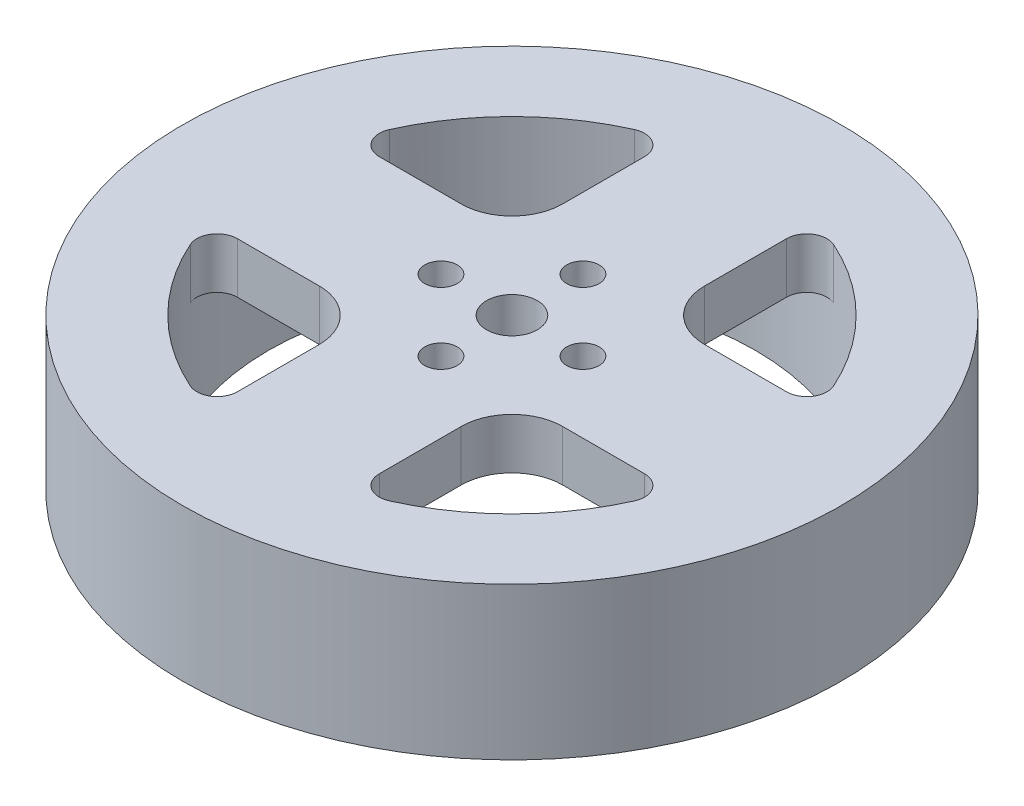
ISO-10303-21;
HEADER;
FILE_DESCRIPTION(('STEP AP214'),'2;1');
FILE_NAME('part.step','',(''),(''),'','','');
FILE_SCHEMA(('AUTOMOTIVE_DESIGN { 1 0 10303 214 1 1 1 1 }'));
ENDSEC;
DATA;
#1=APPLICATION_CONTEXT('core data for automotive mechanical design processes');
#2=APPLICATION_PROTOCOL_DEFINITION('international standard','automotive_design',2000,#1);
#3=PRODUCT_CONTEXT('',#1,'mechanical');
#4=PRODUCT('Part','Part','',(#3));
#5=PRODUCT_RELATED_PRODUCT_CATEGORY('part','',(#4));
#6=PRODUCT_DEFINITION_FORMATION('','',#4);
#7=PRODUCT_DEFINITION_CONTEXT('part definition',#1,'design');
#8=PRODUCT_DEFINITION('design','',#6,#7);
#9=PRODUCT_DEFINITION_SHAPE('','',#8);
#10=(LENGTH_UNIT() NAMED_UNIT(*) SI_UNIT(.MILLI.,.METRE.));
#11=(NAMED_UNIT(*) PLANE_ANGLE_UNIT() SI_UNIT($,.RADIAN.));
#12=(NAMED_UNIT(*) SI_UNIT($,.STERADIAN.) SOLID_ANGLE_UNIT());
#13=UNCERTAINTY_MEASURE_WITH_UNIT(LENGTH_MEASURE(1.E-05),#10,'distance_accuracy_value','');
#14=(GEOMETRIC_REPRESENTATION_CONTEXT(3) GLOBAL_UNCERTAINTY_ASSIGNED_CONTEXT((#13)) GLOBAL_UNIT_ASSIGNED_CONTEXT((#10,
#11,#12)) REPRESENTATION_CONTEXT('',''));
#15=CARTESIAN_POINT('',(0.,0.,0.));
#16=DIRECTION('',(0.,0.,1.));
#17=DIRECTION('',(1.,0.,0.));
#18=AXIS2_PLACEMENT_3D('',#15,#16,#17);
#19=CARTESIAN_POINT('',(0.,15.,0.));
#20=DIRECTION('',(0.,-1.,0.));
#21=DIRECTION('',(0.,0.,-1.));
#22=AXIS2_PLACEMENT_3D('',#19,#20,#21);
#23=CYLINDRICAL_SURFACE('',#22,32.5);
#24=CARTESIAN_POINT('',(0.,15.,0.));
#25=DIRECTION('',(0.,1.,0.));
#26=DIRECTION('',(0.,0.,1.));
#27=AXIS2_PLACEMENT_3D('',#24,#25,#26);
#28=CIRCLE('',#27,32.5);
#29=CARTESIAN_POINT('',(0.,15.,32.5));
#30=VERTEX_POINT('',#29);
#31=EDGE_CURVE('E458',#30,#30,#28,.T.);
#32=ORIENTED_EDGE('',*,*,#31,.F.);
#33=EDGE_LOOP('',(#32));
#34=FACE_BOUND('',#33,.T.);
#35=CARTESIAN_POINT('',(0.,0.,0.));
#36=DIRECTION('',(0.,1.,0.));
#37=DIRECTION('',(0.,0.,1.));
#38=AXIS2_PLACEMENT_3D('',#35,#36,#37);
#39=CIRCLE('',#38,32.5);
#40=CARTESIAN_POINT('',(0.,0.,32.5));
#41=VERTEX_POINT('',#40);
#42=EDGE_CURVE('E446',#41,#41,#39,.T.);
#43=ORIENTED_EDGE('',*,*,#42,.T.);
#44=EDGE_LOOP('',(#43));
#45=FACE_BOUND('',#44,.T.);
#46=ADVANCED_FACE('F38',(#34,#45),#23,.T.);
#47=CARTESIAN_POINT('',(0.,15.,0.));
#48=DIRECTION('',(0.,1.,0.));
#49=DIRECTION('',(0.,0.,1.));
#50=AXIS2_PLACEMENT_3D('',#47,#48,#49);
#51=PLANE('',#50);
#52=CARTESIAN_POINT('',(0.,15.,0.));
#53=DIRECTION('',(0.,1.,0.));
#54=DIRECTION('',(0.,0.,1.));
#55=AXIS2_PLACEMENT_3D('',#52,#53,#54);
#56=CIRCLE('',#55,2.5);
#57=CARTESIAN_POINT('',(0.,15.,2.5));
#58=VERTEX_POINT('',#57);
#59=EDGE_CURVE('E879',#58,#58,#56,.T.);
#60=ORIENTED_EDGE('',*,*,#59,.F.);
#61=EDGE_LOOP('',(#60));
#62=FACE_BOUND('',#61,.T.);
#63=DIRECTION('',(0.,0.,-1.));
#64=VECTOR('',#63,1.);
#65=CARTESIAN_POINT('',(-7.,15.,-22.956480566498));
#66=LINE('',#65,#64);
#67=CARTESIAN_POINT('',(-7.,15.,-12.));
#68=VERTEX_POINT('',#67);
#69=CARTESIAN_POINT('',(-7.,15.,-20.0748598998847));
#70=VERTEX_POINT('',#69);
#71=EDGE_CURVE('E416',#68,#70,#66,.T.);
#72=ORIENTED_EDGE('',*,*,#71,.F.);
#73=CARTESIAN_POINT('',(-12.,15.,-12.));
#74=DIRECTION('',(0.,1.,0.));
#75=DIRECTION('',(0.,0.,1.));
#76=AXIS2_PLACEMENT_3D('',#73,#74,#75);
#77=CIRCLE('',#76,5.);
#78=CARTESIAN_POINT('',(-12.,15.,-7.));
#79=VERTEX_POINT('',#78);
#80=EDGE_CURVE('E502',#68,#79,#77,.F.);
#81=ORIENTED_EDGE('',*,*,#80,.T.);
#82=DIRECTION('',(1.,0.,0.));
#83=VECTOR('',#82,1.);
#84=CARTESIAN_POINT('',(-7.,15.,-7.));
#85=LINE('',#84,#83);
#86=CARTESIAN_POINT('',(-20.0748598998847,15.,-7.));
#87=VERTEX_POINT('',#86);
#88=EDGE_CURVE('E309',#87,#79,#85,.T.);
#89=ORIENTED_EDGE('',*,*,#88,.F.);
#90=CARTESIAN_POINT('',(-20.0748598998847,15.,-9.));
#91=DIRECTION('',(0.,1.,0.));
#92=DIRECTION('',(0.,0.,1.));
#93=AXIS2_PLACEMENT_3D('',#90,#91,#92);
#94=CIRCLE('',#93,2.);
#95=CARTESIAN_POINT('',(-21.8998471635106,15.,-9.81818181818182));
#96=VERTEX_POINT('',#95);
#97=EDGE_CURVE('E284',#87,#96,#94,.F.);
#98=ORIENTED_EDGE('',*,*,#97,.T.);
#99=CARTESIAN_POINT('',(0.,15.,0.));
#100=DIRECTION('',(0.,1.,0.));
#101=DIRECTION('',(0.,0.,1.));
#102=AXIS2_PLACEMENT_3D('',#99,#100,#101);
#103=CIRCLE('',#102,24.);
#104=CARTESIAN_POINT('',(-9.81818181818182,15.,-21.8998471635106));
#105=VERTEX_POINT('',#104);
#106=EDGE_CURVE('E420',#105,#96,#103,.T.);
#107=ORIENTED_EDGE('',*,*,#106,.F.);
#108=CARTESIAN_POINT('',(-9.,15.,-20.0748598998847));
#109=DIRECTION('',(0.,1.,0.));
#110=DIRECTION('',(0.,0.,1.));
#111=AXIS2_PLACEMENT_3D('',#108,#109,#110);
#112=CIRCLE('',#111,2.);
#113=EDGE_CURVE('E287',#105,#70,#112,.F.);
#114=ORIENTED_EDGE('',*,*,#113,.T.);
#115=EDGE_LOOP('',(#72,#81,#89,#98,#107,#114));
#116=FACE_BOUND('',#115,.T.);
#117=DIRECTION('',(0.,0.,1.));
#118=VECTOR('',#117,1.);
#119=CARTESIAN_POINT('',(7.,15.,22.956480566498));
#120=LINE('',#119,#118);
#121=CARTESIAN_POINT('',(7.,15.,12.));
#122=VERTEX_POINT('',#121);
#123=CARTESIAN_POINT('',(7.,15.,20.0748598998847));
#124=VERTEX_POINT('',#123);
#125=EDGE_CURVE('E406',#122,#124,#120,.T.);
#126=ORIENTED_EDGE('',*,*,#125,.F.);
#127=CARTESIAN_POINT('',(12.,15.,12.));
#128=DIRECTION('',(0.,1.,0.));
#129=DIRECTION('',(0.,0.,1.));
#130=AXIS2_PLACEMENT_3D('',#127,#128,#129);
#131=CIRCLE('',#130,5.);
#132=CARTESIAN_POINT('',(12.,15.,7.));
#133=VERTEX_POINT('',#132);
#134=EDGE_CURVE('E495',#122,#133,#131,.F.);
#135=ORIENTED_EDGE('',*,*,#134,.T.);
#136=DIRECTION('',(-1.,0.,0.));
#137=VECTOR('',#136,1.);
#138=CARTESIAN_POINT('',(7.,15.,7.));
#139=LINE('',#138,#137);
#140=CARTESIAN_POINT('',(20.0748598998847,15.,7.));
#141=VERTEX_POINT('',#140);
#142=EDGE_CURVE('E421',#141,#133,#139,.T.);
#143=ORIENTED_EDGE('',*,*,#142,.F.);
#144=CARTESIAN_POINT('',(20.0748598998847,15.,9.));
#145=DIRECTION('',(0.,1.,0.));
#146=DIRECTION('',(0.,0.,1.));
#147=AXIS2_PLACEMENT_3D('',#144,#145,#146);
#148=CIRCLE('',#147,2.);
#149=CARTESIAN_POINT('',(21.8998471635106,15.,9.81818181818182));
#150=VERTEX_POINT('',#149);
#151=EDGE_CURVE('E281',#141,#150,#148,.F.);
#152=ORIENTED_EDGE('',*,*,#151,.T.);
#153=CARTESIAN_POINT('',(0.,15.,0.));
#154=DIRECTION('',(0.,1.,0.));
#155=DIRECTION('',(0.,0.,1.));
#156=AXIS2_PLACEMENT_3D('',#153,#154,#155);
#157=CIRCLE('',#156,24.);
#158=CARTESIAN_POINT('',(9.81818181818182,15.,21.8998471635106));
#159=VERTEX_POINT('',#158);
#160=EDGE_CURVE('E430',#159,#150,#157,.T.);
#161=ORIENTED_EDGE('',*,*,#160,.F.);
#162=CARTESIAN_POINT('',(9.,15.,20.0748598998847));
#163=DIRECTION('',(0.,1.,0.));
#164=DIRECTION('',(0.,0.,1.));
#165=AXIS2_PLACEMENT_3D('',#162,#163,#164);
#166=CIRCLE('',#165,2.);
#167=EDGE_CURVE('E230',#159,#124,#166,.F.);
#168=ORIENTED_EDGE('',*,*,#167,.T.);
#169=EDGE_LOOP('',(#126,#135,#143,#152,#161,#168));
#170=FACE_BOUND('',#169,.T.);
#171=DIRECTION('',(0.,0.,-1.));
#172=VECTOR('',#171,1.);
#173=CARTESIAN_POINT('',(-7.,15.,22.956480566498));
#174=LINE('',#173,#172);
#175=CARTESIAN_POINT('',(-7.,15.,20.0748598998847));
#176=VERTEX_POINT('',#175);
#177=CARTESIAN_POINT('',(-7.,15.,12.));
#178=VERTEX_POINT('',#177);
#179=EDGE_CURVE('E401',#176,#178,#174,.T.);
#180=ORIENTED_EDGE('',*,*,#179,.F.);
#181=CARTESIAN_POINT('',(-9.,15.,20.0748598998847));
#182=DIRECTION('',(0.,1.,0.));
#183=DIRECTION('',(0.,0.,1.));
#184=AXIS2_PLACEMENT_3D('',#181,#182,#183);
#185=CIRCLE('',#184,2.);
#186=CARTESIAN_POINT('',(-9.81818181818182,15.,21.8998471635106));
#187=VERTEX_POINT('',#186);
#188=EDGE_CURVE('E276',#176,#187,#185,.F.);
#189=ORIENTED_EDGE('',*,*,#188,.T.);
#190=CARTESIAN_POINT('',(0.,15.,0.));
#191=DIRECTION('',(0.,1.,0.));
#192=DIRECTION('',(0.,0.,1.));
#193=AXIS2_PLACEMENT_3D('',#190,#191,#192);
#194=CIRCLE('',#193,24.);
#195=CARTESIAN_POINT('',(-21.8998471635106,15.,9.81818181818182));
#196=VERTEX_POINT('',#195);
#197=EDGE_CURVE('E407',#196,#187,#194,.T.);
#198=ORIENTED_EDGE('',*,*,#197,.F.);
#199=CARTESIAN_POINT('',(-20.0748598998847,15.,9.));
#200=DIRECTION('',(0.,1.,0.));
#201=DIRECTION('',(0.,0.,1.));
#202=AXIS2_PLACEMENT_3D('',#199,#200,#201);
#203=CIRCLE('',#202,2.);
#204=CARTESIAN_POINT('',(-20.0748598998847,15.,7.));
#205=VERTEX_POINT('',#204);
#206=EDGE_CURVE('E273',#196,#205,#203,.F.);
#207=ORIENTED_EDGE('',*,*,#206,.T.);
#208=DIRECTION('',(-1.,0.,0.));
#209=VECTOR('',#208,1.);
#210=CARTESIAN_POINT('',(-7.,15.,7.));
#211=LINE('',#210,#209);
#212=CARTESIAN_POINT('',(-12.,15.,7.));
#213=VERTEX_POINT('',#212);
#214=EDGE_CURVE('E410',#213,#205,#211,.T.);
#215=ORIENTED_EDGE('',*,*,#214,.F.);
#216=CARTESIAN_POINT('',(-12.,15.,12.));
#217=DIRECTION('',(0.,1.,0.));
#218=DIRECTION('',(0.,0.,1.));
#219=AXIS2_PLACEMENT_3D('',#216,#217,#218);
#220=CIRCLE('',#219,5.);
#221=EDGE_CURVE('E491',#213,#178,#220,.F.);
#222=ORIENTED_EDGE('',*,*,#221,.T.);
#223=EDGE_LOOP('',(#180,#189,#198,#207,#215,#222));
#224=FACE_BOUND('',#223,.T.);
#225=CARTESIAN_POINT('',(0.,15.,0.));
#226=DIRECTION('',(0.,1.,0.));
#227=DIRECTION('',(0.,0.,1.));
#228=AXIS2_PLACEMENT_3D('',#225,#226,#227);
#229=CIRCLE('',#228,24.);
#230=CARTESIAN_POINT('',(21.8998471635106,15.,-9.81818181818182));
#231=VERTEX_POINT('',#230);
#232=CARTESIAN_POINT('',(9.81818181818182,15.,-21.8998471635106));
#233=VERTEX_POINT('',#232);
#234=EDGE_CURVE('E300',#231,#233,#229,.T.);
#235=ORIENTED_EDGE('',*,*,#234,.F.);
#236=CARTESIAN_POINT('',(20.0748598998847,15.,-9.));
#237=DIRECTION('',(0.,1.,0.));
#238=DIRECTION('',(0.,0.,1.));
#239=AXIS2_PLACEMENT_3D('',#236,#237,#238);
#240=CIRCLE('',#239,2.);
#241=CARTESIAN_POINT('',(20.0748598998847,15.,-7.));
#242=VERTEX_POINT('',#241);
#243=EDGE_CURVE('E290',#231,#242,#240,.F.);
#244=ORIENTED_EDGE('',*,*,#243,.T.);
#245=DIRECTION('',(1.,0.,0.));
#246=VECTOR('',#245,1.);
#247=CARTESIAN_POINT('',(7.,15.,-7.));
#248=LINE('',#247,#246);
#249=CARTESIAN_POINT('',(12.,15.,-7.));
#250=VERTEX_POINT('',#249);
#251=EDGE_CURVE('E437',#250,#242,#248,.T.);
#252=ORIENTED_EDGE('',*,*,#251,.F.);
#253=CARTESIAN_POINT('',(12.,15.,-12.));
#254=DIRECTION('',(0.,1.,0.));
#255=DIRECTION('',(0.,0.,1.));
#256=AXIS2_PLACEMENT_3D('',#253,#254,#255);
#257=CIRCLE('',#256,5.);
#258=CARTESIAN_POINT('',(7.,15.,-12.));
#259=VERTEX_POINT('',#258);
#260=EDGE_CURVE('E499',#250,#259,#257,.F.);
#261=ORIENTED_EDGE('',*,*,#260,.T.);
#262=DIRECTION('',(0.,0.,1.));
#263=VECTOR('',#262,1.);
#264=CARTESIAN_POINT('',(7.,15.,-22.956480566498));
#265=LINE('',#264,#263);
#266=CARTESIAN_POINT('',(7.,15.,-20.0748598998847));
#267=VERTEX_POINT('',#266);
#268=EDGE_CURVE('E302',#267,#259,#265,.T.);
#269=ORIENTED_EDGE('',*,*,#268,.F.);
#270=CARTESIAN_POINT('',(9.,15.,-20.0748598998847));
#271=DIRECTION('',(0.,1.,0.));
#272=DIRECTION('',(0.,0.,1.));
#273=AXIS2_PLACEMENT_3D('',#270,#271,#272);
#274=CIRCLE('',#273,2.);
#275=EDGE_CURVE('E48',#267,#233,#274,.F.);
#276=ORIENTED_EDGE('',*,*,#275,.T.);
#277=EDGE_LOOP('',(#235,#244,#252,#261,#269,#276));
#278=FACE_BOUND('',#277,.T.);
#279=CARTESIAN_POINT('',(7.00000000000001,15.,0.));
#280=DIRECTION('',(0.,1.,0.));
#281=DIRECTION('',(0.,0.,1.));
#282=AXIS2_PLACEMENT_3D('',#279,#280,#281);
#283=CIRCLE('',#282,1.6);
#284=CARTESIAN_POINT('',(7.00000000000001,15.,1.6));
#285=VERTEX_POINT('',#284);
#286=EDGE_CURVE('E442',#285,#285,#283,.T.);
#287=ORIENTED_EDGE('',*,*,#286,.F.);
#288=EDGE_LOOP('',(#287));
#289=FACE_BOUND('',#288,.T.);
#290=CARTESIAN_POINT('',(0.,15.,7.00000000000001));
#291=DIRECTION('',(0.,1.,0.));
#292=DIRECTION('',(0.,0.,1.));
#293=AXIS2_PLACEMENT_3D('',#290,#291,#292);
#294=CIRCLE('',#293,1.6);
#295=CARTESIAN_POINT('',(0.,15.,8.60000000000001));
#296=VERTEX_POINT('',#295);
#297=EDGE_CURVE('E447',#296,#296,#294,.T.);
#298=ORIENTED_EDGE('',*,*,#297,.F.);
#299=EDGE_LOOP('',(#298));
#300=FACE_BOUND('',#299,.T.);
#301=CARTESIAN_POINT('',(-7.00000000000001,15.,0.));
#302=DIRECTION('',(0.,1.,0.));
#303=DIRECTION('',(0.,0.,1.));
#304=AXIS2_PLACEMENT_3D('',#301,#302,#303);
#305=CIRCLE('',#304,1.6);
#306=CARTESIAN_POINT('',(-7.00000000000001,15.,1.6));
#307=VERTEX_POINT('',#306);
#308=EDGE_CURVE('E451',#307,#307,#305,.T.);
#309=ORIENTED_EDGE('',*,*,#308,.F.);
#310=EDGE_LOOP('',(#309));
#311=FACE_BOUND('',#310,.T.);
#312=CARTESIAN_POINT('',(0.,15.,-7.00000000000001));
#313=DIRECTION('',(0.,1.,0.));
#314=DIRECTION('',(0.,0.,1.));
#315=AXIS2_PLACEMENT_3D('',#312,#313,#314);
#316=CIRCLE('',#315,1.6);
#317=CARTESIAN_POINT('',(0.,15.,-5.40000000000001));
#318=VERTEX_POINT('',#317);
#319=EDGE_CURVE('E441',#318,#318,#316,.T.);
#320=ORIENTED_EDGE('',*,*,#319,.F.);
#321=EDGE_LOOP('',(#320));
#322=FACE_BOUND('',#321,.T.);
#323=ORIENTED_EDGE('',*,*,#31,.T.);
#324=EDGE_LOOP('',(#323));
#325=FACE_BOUND('',#324,.T.);
#326=ADVANCED_FACE('F298',(#62,#116,#170,#224,#278,#289,#300,#311,#322,#325),#51,.T.);
#327=CARTESIAN_POINT('',(0.,0.,0.));
#328=DIRECTION('',(0.,1.,0.));
#329=DIRECTION('',(0.,0.,1.));
#330=AXIS2_PLACEMENT_3D('',#327,#328,#329);
#331=PLANE('',#330);
#332=CARTESIAN_POINT('',(0.,0.,0.));
#333=DIRECTION('',(0.,1.,0.));
#334=DIRECTION('',(0.,0.,1.));
#335=AXIS2_PLACEMENT_3D('',#332,#333,#334);
#336=CIRCLE('',#335,24.);
#337=CARTESIAN_POINT('',(0.,0.,24.));
#338=VERTEX_POINT('',#337);
#339=EDGE_CURVE('E402',#338,#338,#336,.T.);
#340=ORIENTED_EDGE('',*,*,#339,.T.);
#341=EDGE_LOOP('',(#340));
#342=FACE_BOUND('',#341,.T.);
#343=ORIENTED_EDGE('',*,*,#42,.F.);
#344=EDGE_LOOP('',(#343));
#345=FACE_BOUND('',#344,.T.);
#346=ADVANCED_FACE('F583',(#342,#345),#331,.F.);
#347=CARTESIAN_POINT('',(0.,-12.,-7.00000000000001));
#348=DIRECTION('',(0.,1.,0.));
#349=DIRECTION('',(0.,0.,1.));
#350=AXIS2_PLACEMENT_3D('',#347,#348,#349);
#351=CYLINDRICAL_SURFACE('',#350,1.6);
#352=CARTESIAN_POINT('',(0.,10.,-7.00000000000001));
#353=DIRECTION('',(0.,1.,0.));
#354=DIRECTION('',(0.,0.,1.));
#355=AXIS2_PLACEMENT_3D('',#352,#353,#354);
#356=CIRCLE('',#355,1.6);
#357=CARTESIAN_POINT('',(0.,10.,-5.40000000000001));
#358=VERTEX_POINT('',#357);
#359=EDGE_CURVE('E397',#358,#358,#356,.F.);
#360=ORIENTED_EDGE('',*,*,#359,.T.);
#361=EDGE_LOOP('',(#360));
#362=FACE_BOUND('',#361,.T.);
#363=ORIENTED_EDGE('',*,*,#319,.T.);
#364=EDGE_LOOP('',(#363));
#365=FACE_BOUND('',#364,.T.);
#366=ADVANCED_FACE('F658',(#362,#365),#351,.F.);
#367=CARTESIAN_POINT('',(-7.00000000000001,-12.,0.));
#368=DIRECTION('',(0.,1.,0.));
#369=DIRECTION('',(0.,0.,1.));
#370=AXIS2_PLACEMENT_3D('',#367,#368,#369);
#371=CYLINDRICAL_SURFACE('',#370,1.6);
#372=CARTESIAN_POINT('',(-7.00000000000001,10.,0.));
#373=DIRECTION('',(0.,1.,0.));
#374=DIRECTION('',(0.,0.,1.));
#375=AXIS2_PLACEMENT_3D('',#372,#373,#374);
#376=CIRCLE('',#375,1.6);
#377=CARTESIAN_POINT('',(-7.00000000000001,10.,1.6));
#378=VERTEX_POINT('',#377);
#379=EDGE_CURVE('E393',#378,#378,#376,.F.);
#380=ORIENTED_EDGE('',*,*,#379,.T.);
#381=EDGE_LOOP('',(#380));
#382=FACE_BOUND('',#381,.T.);
#383=ORIENTED_EDGE('',*,*,#308,.T.);
#384=EDGE_LOOP('',(#383));
#385=FACE_BOUND('',#384,.T.);
#386=ADVANCED_FACE('F654',(#382,#385),#371,.F.);
#387=CARTESIAN_POINT('',(0.,-12.,7.00000000000001));
#388=DIRECTION('',(0.,1.,0.));
#389=DIRECTION('',(0.,0.,1.));
#390=AXIS2_PLACEMENT_3D('',#387,#388,#389);
#391=CYLINDRICAL_SURFACE('',#390,1.6);
#392=CARTESIAN_POINT('',(0.,10.,7.00000000000001));
#393=DIRECTION('',(0.,1.,0.));
#394=DIRECTION('',(0.,0.,1.));
#395=AXIS2_PLACEMENT_3D('',#392,#393,#394);
#396=CIRCLE('',#395,1.6);
#397=CARTESIAN_POINT('',(0.,10.,8.60000000000001));
#398=VERTEX_POINT('',#397);
#399=EDGE_CURVE('E389',#398,#398,#396,.F.);
#400=ORIENTED_EDGE('',*,*,#399,.T.);
#401=EDGE_LOOP('',(#400));
#402=FACE_BOUND('',#401,.T.);
#403=ORIENTED_EDGE('',*,*,#297,.T.);
#404=EDGE_LOOP('',(#403));
#405=FACE_BOUND('',#404,.T.);
#406=ADVANCED_FACE('F650',(#402,#405),#391,.F.);
#407=CARTESIAN_POINT('',(7.00000000000001,-12.,0.));
#408=DIRECTION('',(0.,1.,0.));
#409=DIRECTION('',(0.,0.,1.));
#410=AXIS2_PLACEMENT_3D('',#407,#408,#409);
#411=CYLINDRICAL_SURFACE('',#410,1.6);
#412=CARTESIAN_POINT('',(7.00000000000001,10.,0.));
#413=DIRECTION('',(0.,1.,0.));
#414=DIRECTION('',(0.,0.,1.));
#415=AXIS2_PLACEMENT_3D('',#412,#413,#414);
#416=CIRCLE('',#415,1.6);
#417=CARTESIAN_POINT('',(7.00000000000001,10.,1.6));
#418=VERTEX_POINT('',#417);
#419=EDGE_CURVE('E385',#418,#418,#416,.F.);
#420=ORIENTED_EDGE('',*,*,#419,.T.);
#421=EDGE_LOOP('',(#420));
#422=FACE_BOUND('',#421,.T.);
#423=ORIENTED_EDGE('',*,*,#286,.T.);
#424=EDGE_LOOP('',(#423));
#425=FACE_BOUND('',#424,.T.);
#426=ADVANCED_FACE('F645',(#422,#425),#411,.F.);
#427=CARTESIAN_POINT('',(7.,0.,-7.));
#428=DIRECTION('',(0.,0.,1.));
#429=DIRECTION('',(1.,0.,0.));
#430=AXIS2_PLACEMENT_3D('',#427,#428,#429);
#431=PLANE('',#430);
#432=DIRECTION('',(0.,-1.,0.));
#433=VECTOR('',#432,1.);
#434=CARTESIAN_POINT('',(20.0748598998847,0.,-7.));
#435=LINE('',#434,#433);
#436=CARTESIAN_POINT('',(20.0748598998847,10.,-7.));
#437=VERTEX_POINT('',#436);
#438=EDGE_CURVE('E267',#242,#437,#435,.T.);
#439=ORIENTED_EDGE('',*,*,#438,.T.);
#440=DIRECTION('',(-1.,0.,0.));
#441=VECTOR('',#440,1.);
#442=CARTESIAN_POINT('',(7.,10.,-7.));
#443=LINE('',#442,#441);
#444=CARTESIAN_POINT('',(12.,10.,-7.));
#445=VERTEX_POINT('',#444);
#446=EDGE_CURVE('E322',#437,#445,#443,.T.);
#447=ORIENTED_EDGE('',*,*,#446,.T.);
#448=DIRECTION('',(0.,1.,0.));
#449=VECTOR('',#448,1.);
#450=CARTESIAN_POINT('',(12.,15.,-7.));
#451=LINE('',#450,#449);
#452=EDGE_CURVE('E479',#445,#250,#451,.T.);
#453=ORIENTED_EDGE('',*,*,#452,.T.);
#454=ORIENTED_EDGE('',*,*,#251,.T.);
#455=EDGE_LOOP('',(#439,#447,#453,#454));
#456=FACE_BOUND('',#455,.T.);
#457=ADVANCED_FACE('F624',(#456),#431,.F.);
#458=CARTESIAN_POINT('',(7.,0.,-22.956480566498));
#459=DIRECTION('',(-1.,0.,0.));
#460=DIRECTION('',(0.,0.,1.));
#461=AXIS2_PLACEMENT_3D('',#458,#459,#460);
#462=PLANE('',#461);
#463=DIRECTION('',(0.,1.,0.));
#464=VECTOR('',#463,1.);
#465=CARTESIAN_POINT('',(7.,0.,-12.));
#466=LINE('',#465,#464);
#467=CARTESIAN_POINT('',(7.,10.,-12.));
#468=VERTEX_POINT('',#467);
#469=EDGE_CURVE('E316',#259,#468,#466,.F.);
#470=ORIENTED_EDGE('',*,*,#469,.T.);
#471=DIRECTION('',(0.,0.,-1.));
#472=VECTOR('',#471,1.);
#473=CARTESIAN_POINT('',(7.,10.,-22.956480566498));
#474=LINE('',#473,#472);
#475=CARTESIAN_POINT('',(7.,10.,-20.0748598998847));
#476=VERTEX_POINT('',#475);
#477=EDGE_CURVE('E311',#468,#476,#474,.T.);
#478=ORIENTED_EDGE('',*,*,#477,.T.);
#479=DIRECTION('',(0.,-1.,0.));
#480=VECTOR('',#479,1.);
#481=CARTESIAN_POINT('',(7.,15.,-20.0748598998847));
#482=LINE('',#481,#480);
#483=EDGE_CURVE('E62',#476,#267,#482,.F.);
#484=ORIENTED_EDGE('',*,*,#483,.T.);
#485=ORIENTED_EDGE('',*,*,#268,.T.);
#486=EDGE_LOOP('',(#470,#478,#484,#485));
#487=FACE_BOUND('',#486,.T.);
#488=ADVANCED_FACE('F314',(#487),#462,.F.);
#489=CARTESIAN_POINT('',(-7.,0.,22.956480566498));
#490=DIRECTION('',(1.,0.,0.));
#491=DIRECTION('',(0.,0.,-1.));
#492=AXIS2_PLACEMENT_3D('',#489,#490,#491);
#493=PLANE('',#492);
#494=DIRECTION('',(0.,1.,0.));
#495=VECTOR('',#494,1.);
#496=CARTESIAN_POINT('',(-7.,0.,12.));
#497=LINE('',#496,#495);
#498=CARTESIAN_POINT('',(-7.,10.,12.));
#499=VERTEX_POINT('',#498);
#500=EDGE_CURVE('E468',#178,#499,#497,.F.);
#501=ORIENTED_EDGE('',*,*,#500,.T.);
#502=DIRECTION('',(0.,0.,1.));
#503=VECTOR('',#502,1.);
#504=CARTESIAN_POINT('',(-7.,10.,22.956480566498));
#505=LINE('',#504,#503);
#506=CARTESIAN_POINT('',(-7.,10.,20.0748598998847));
#507=VERTEX_POINT('',#506);
#508=EDGE_CURVE('E369',#499,#507,#505,.T.);
#509=ORIENTED_EDGE('',*,*,#508,.T.);
#510=DIRECTION('',(0.,-1.,0.));
#511=VECTOR('',#510,1.);
#512=CARTESIAN_POINT('',(-7.,15.,20.0748598998847));
#513=LINE('',#512,#511);
#514=EDGE_CURVE('E241',#507,#176,#513,.F.);
#515=ORIENTED_EDGE('',*,*,#514,.T.);
#516=ORIENTED_EDGE('',*,*,#179,.T.);
#517=EDGE_LOOP('',(#501,#509,#515,#516));
#518=FACE_BOUND('',#517,.T.);
#519=ADVANCED_FACE('F518',(#518),#493,.F.);
#520=CARTESIAN_POINT('',(-7.,0.,7.));
#521=DIRECTION('',(0.,0.,-1.));
#522=DIRECTION('',(-1.,0.,0.));
#523=AXIS2_PLACEMENT_3D('',#520,#521,#522);
#524=PLANE('',#523);
#525=DIRECTION('',(0.,-1.,0.));
#526=VECTOR('',#525,1.);
#527=CARTESIAN_POINT('',(-20.0748598998847,0.,7.));
#528=LINE('',#527,#526);
#529=CARTESIAN_POINT('',(-20.0748598998847,10.,7.));
#530=VERTEX_POINT('',#529);
#531=EDGE_CURVE('E511',#205,#530,#528,.T.);
#532=ORIENTED_EDGE('',*,*,#531,.T.);
#533=DIRECTION('',(1.,0.,0.));
#534=VECTOR('',#533,1.);
#535=CARTESIAN_POINT('',(-7.,10.,7.));
#536=LINE('',#535,#534);
#537=CARTESIAN_POINT('',(-12.,10.,7.));
#538=VERTEX_POINT('',#537);
#539=EDGE_CURVE('E377',#530,#538,#536,.T.);
#540=ORIENTED_EDGE('',*,*,#539,.T.);
#541=DIRECTION('',(0.,1.,0.));
#542=VECTOR('',#541,1.);
#543=CARTESIAN_POINT('',(-12.,15.,7.));
#544=LINE('',#543,#542);
#545=EDGE_CURVE('E462',#538,#213,#544,.T.);
#546=ORIENTED_EDGE('',*,*,#545,.T.);
#547=ORIENTED_EDGE('',*,*,#214,.T.);
#548=EDGE_LOOP('',(#532,#540,#546,#547));
#549=FACE_BOUND('',#548,.T.);
#550=ADVANCED_FACE('F531',(#549),#524,.F.);
#551=CARTESIAN_POINT('',(7.,0.,22.956480566498));
#552=DIRECTION('',(-1.,0.,0.));
#553=DIRECTION('',(0.,0.,1.));
#554=AXIS2_PLACEMENT_3D('',#551,#552,#553);
#555=PLANE('',#554);
#556=DIRECTION('',(0.,-1.,0.));
#557=VECTOR('',#556,1.);
#558=CARTESIAN_POINT('',(7.,0.,20.0748598998847));
#559=LINE('',#558,#557);
#560=CARTESIAN_POINT('',(7.,10.,20.0748598998847));
#561=VERTEX_POINT('',#560);
#562=EDGE_CURVE('E233',#124,#561,#559,.T.);
#563=ORIENTED_EDGE('',*,*,#562,.T.);
#564=DIRECTION('',(0.,0.,-1.));
#565=VECTOR('',#564,1.);
#566=CARTESIAN_POINT('',(7.,10.,22.956480566498));
#567=LINE('',#566,#565);
#568=CARTESIAN_POINT('',(7.,10.,12.));
#569=VERTEX_POINT('',#568);
#570=EDGE_CURVE('E206',#561,#569,#567,.T.);
#571=ORIENTED_EDGE('',*,*,#570,.T.);
#572=DIRECTION('',(0.,1.,0.));
#573=VECTOR('',#572,1.);
#574=CARTESIAN_POINT('',(7.,15.,12.));
#575=LINE('',#574,#573);
#576=EDGE_CURVE('E472',#569,#122,#575,.T.);
#577=ORIENTED_EDGE('',*,*,#576,.T.);
#578=ORIENTED_EDGE('',*,*,#125,.T.);
#579=EDGE_LOOP('',(#563,#571,#577,#578));
#580=FACE_BOUND('',#579,.T.);
#581=ADVANCED_FACE('F572',(#580),#555,.F.);
#582=CARTESIAN_POINT('',(7.,0.,7.));
#583=DIRECTION('',(0.,0.,-1.));
#584=DIRECTION('',(-1.,0.,0.));
#585=AXIS2_PLACEMENT_3D('',#582,#583,#584);
#586=PLANE('',#585);
#587=DIRECTION('',(0.,1.,0.));
#588=VECTOR('',#587,1.);
#589=CARTESIAN_POINT('',(12.,0.,7.));
#590=LINE('',#589,#588);
#591=CARTESIAN_POINT('',(12.,10.,7.));
#592=VERTEX_POINT('',#591);
#593=EDGE_CURVE('E475',#133,#592,#590,.F.);
#594=ORIENTED_EDGE('',*,*,#593,.T.);
#595=DIRECTION('',(1.,0.,0.));
#596=VECTOR('',#595,1.);
#597=CARTESIAN_POINT('',(7.,10.,7.));
#598=LINE('',#597,#596);
#599=CARTESIAN_POINT('',(20.0748598998847,10.,7.));
#600=VERTEX_POINT('',#599);
#601=EDGE_CURVE('E357',#592,#600,#598,.T.);
#602=ORIENTED_EDGE('',*,*,#601,.T.);
#603=DIRECTION('',(0.,-1.,0.));
#604=VECTOR('',#603,1.);
#605=CARTESIAN_POINT('',(20.0748598998847,15.,7.));
#606=LINE('',#605,#604);
#607=EDGE_CURVE('E238',#600,#141,#606,.F.);
#608=ORIENTED_EDGE('',*,*,#607,.T.);
#609=ORIENTED_EDGE('',*,*,#142,.T.);
#610=EDGE_LOOP('',(#594,#602,#608,#609));
#611=FACE_BOUND('',#610,.T.);
#612=ADVANCED_FACE('F565',(#611),#586,.F.);
#613=CARTESIAN_POINT('',(-7.,0.,-22.956480566498));
#614=DIRECTION('',(1.,0.,0.));
#615=DIRECTION('',(0.,0.,-1.));
#616=AXIS2_PLACEMENT_3D('',#613,#614,#615);
#617=PLANE('',#616);
#618=DIRECTION('',(0.,-1.,0.));
#619=VECTOR('',#618,1.);
#620=CARTESIAN_POINT('',(-7.,0.,-20.0748598998847));
#621=LINE('',#620,#619);
#622=CARTESIAN_POINT('',(-7.,10.,-20.0748598998847));
#623=VERTEX_POINT('',#622);
#624=EDGE_CURVE('E256',#70,#623,#621,.T.);
#625=ORIENTED_EDGE('',*,*,#624,.T.);
#626=DIRECTION('',(0.,0.,1.));
#627=VECTOR('',#626,1.);
#628=CARTESIAN_POINT('',(-7.,10.,-22.956480566498));
#629=LINE('',#628,#627);
#630=CARTESIAN_POINT('',(-7.,10.,-12.));
#631=VERTEX_POINT('',#630);
#632=EDGE_CURVE('E337',#623,#631,#629,.T.);
#633=ORIENTED_EDGE('',*,*,#632,.T.);
#634=DIRECTION('',(0.,1.,0.));
#635=VECTOR('',#634,1.);
#636=CARTESIAN_POINT('',(-7.,15.,-12.));
#637=LINE('',#636,#635);
#638=EDGE_CURVE('E484',#631,#68,#637,.T.);
#639=ORIENTED_EDGE('',*,*,#638,.T.);
#640=ORIENTED_EDGE('',*,*,#71,.T.);
#641=EDGE_LOOP('',(#625,#633,#639,#640));
#642=FACE_BOUND('',#641,.T.);
#643=ADVANCED_FACE('F563',(#642),#617,.F.);
#644=CARTESIAN_POINT('',(-7.,0.,-7.));
#645=DIRECTION('',(0.,0.,1.));
#646=DIRECTION('',(1.,0.,0.));
#647=AXIS2_PLACEMENT_3D('',#644,#645,#646);
#648=PLANE('',#647);
#649=DIRECTION('',(0.,1.,0.));
#650=VECTOR('',#649,1.);
#651=CARTESIAN_POINT('',(-12.,0.,-7.));
#652=LINE('',#651,#650);
#653=CARTESIAN_POINT('',(-12.,10.,-7.));
#654=VERTEX_POINT('',#653);
#655=EDGE_CURVE('E487',#79,#654,#652,.F.);
#656=ORIENTED_EDGE('',*,*,#655,.T.);
#657=DIRECTION('',(-1.,0.,0.));
#658=VECTOR('',#657,1.);
#659=CARTESIAN_POINT('',(-7.,10.,-7.));
#660=LINE('',#659,#658);
#661=CARTESIAN_POINT('',(-20.0748598998847,10.,-7.));
#662=VERTEX_POINT('',#661);
#663=EDGE_CURVE('E345',#654,#662,#660,.T.);
#664=ORIENTED_EDGE('',*,*,#663,.T.);
#665=DIRECTION('',(0.,-1.,0.));
#666=VECTOR('',#665,1.);
#667=CARTESIAN_POINT('',(-20.0748598998847,15.,-7.));
#668=LINE('',#667,#666);
#669=EDGE_CURVE('E247',#662,#87,#668,.F.);
#670=ORIENTED_EDGE('',*,*,#669,.T.);
#671=ORIENTED_EDGE('',*,*,#88,.T.);
#672=EDGE_LOOP('',(#656,#664,#670,#671));
#673=FACE_BOUND('',#672,.T.);
#674=ADVANCED_FACE('F556',(#673),#648,.F.);
#675=CARTESIAN_POINT('',(0.,0.,0.));
#676=DIRECTION('',(0.,1.,0.));
#677=DIRECTION('',(0.,0.,1.));
#678=AXIS2_PLACEMENT_3D('',#675,#676,#677);
#679=CYLINDRICAL_SURFACE('',#678,24.);
#680=DIRECTION('',(0.,1.,0.));
#681=VECTOR('',#680,1.);
#682=CARTESIAN_POINT('',(-21.8998471635106,0.,-9.81818181818182));
#683=LINE('',#682,#681);
#684=CARTESIAN_POINT('',(-21.8998471635106,10.,-9.81818181818182));
#685=VERTEX_POINT('',#684);
#686=EDGE_CURVE('E253',#96,#685,#683,.F.);
#687=ORIENTED_EDGE('',*,*,#686,.T.);
#688=CARTESIAN_POINT('',(0.,10.,0.));
#689=DIRECTION('',(0.,1.,0.));
#690=DIRECTION('',(0.,0.,1.));
#691=AXIS2_PLACEMENT_3D('',#688,#689,#690);
#692=CIRCLE('',#691,24.);
#693=CARTESIAN_POINT('',(-21.8998471635106,10.,9.81818181818182));
#694=VERTEX_POINT('',#693);
#695=EDGE_CURVE('E226',#685,#694,#692,.T.);
#696=ORIENTED_EDGE('',*,*,#695,.T.);
#697=DIRECTION('',(0.,1.,0.));
#698=VECTOR('',#697,1.);
#699=CARTESIAN_POINT('',(-21.8998471635106,0.,9.81818181818182));
#700=LINE('',#699,#698);
#701=EDGE_CURVE('E508',#694,#196,#700,.T.);
#702=ORIENTED_EDGE('',*,*,#701,.T.);
#703=ORIENTED_EDGE('',*,*,#197,.T.);
#704=DIRECTION('',(0.,1.,0.));
#705=VECTOR('',#704,1.);
#706=CARTESIAN_POINT('',(-9.81818181818182,0.,21.8998471635106));
#707=LINE('',#706,#705);
#708=CARTESIAN_POINT('',(-9.81818181818182,10.,21.8998471635106));
#709=VERTEX_POINT('',#708);
#710=EDGE_CURVE('E224',#187,#709,#707,.F.);
#711=ORIENTED_EDGE('',*,*,#710,.T.);
#712=CARTESIAN_POINT('',(9.81818181818182,10.,21.8998471635106));
#713=VERTEX_POINT('',#712);
#714=EDGE_CURVE('E203',#709,#713,#692,.T.);
#715=ORIENTED_EDGE('',*,*,#714,.T.);
#716=DIRECTION('',(0.,1.,0.));
#717=VECTOR('',#716,1.);
#718=CARTESIAN_POINT('',(9.81818181818182,0.,21.8998471635106));
#719=LINE('',#718,#717);
#720=EDGE_CURVE('E220',#713,#159,#719,.T.);
#721=ORIENTED_EDGE('',*,*,#720,.T.);
#722=ORIENTED_EDGE('',*,*,#160,.T.);
#723=DIRECTION('',(0.,1.,0.));
#724=VECTOR('',#723,1.);
#725=CARTESIAN_POINT('',(21.8998471635106,0.,9.81818181818182));
#726=LINE('',#725,#724);
#727=CARTESIAN_POINT('',(21.8998471635106,10.,9.81818181818182));
#728=VERTEX_POINT('',#727);
#729=EDGE_CURVE('E234',#150,#728,#726,.F.);
#730=ORIENTED_EDGE('',*,*,#729,.T.);
#731=CARTESIAN_POINT('',(21.8998471635106,10.,-9.81818181818182));
#732=VERTEX_POINT('',#731);
#733=EDGE_CURVE('E228',#728,#732,#692,.T.);
#734=ORIENTED_EDGE('',*,*,#733,.T.);
#735=DIRECTION('',(0.,1.,0.));
#736=VECTOR('',#735,1.);
#737=CARTESIAN_POINT('',(21.8998471635106,0.,-9.81818181818182));
#738=LINE('',#737,#736);
#739=EDGE_CURVE('E264',#732,#231,#738,.T.);
#740=ORIENTED_EDGE('',*,*,#739,.T.);
#741=ORIENTED_EDGE('',*,*,#234,.T.);
#742=DIRECTION('',(0.,1.,0.));
#743=VECTOR('',#742,1.);
#744=CARTESIAN_POINT('',(9.81818181818182,0.,-21.8998471635106));
#745=LINE('',#744,#743);
#746=CARTESIAN_POINT('',(9.81818181818182,10.,-21.8998471635106));
#747=VERTEX_POINT('',#746);
#748=EDGE_CURVE('E260',#233,#747,#745,.F.);
#749=ORIENTED_EDGE('',*,*,#748,.T.);
#750=CARTESIAN_POINT('',(-9.81818181818182,10.,-21.8998471635106));
#751=VERTEX_POINT('',#750);
#752=EDGE_CURVE('E55',#747,#751,#692,.T.);
#753=ORIENTED_EDGE('',*,*,#752,.T.);
#754=DIRECTION('',(0.,1.,0.));
#755=VECTOR('',#754,1.);
#756=CARTESIAN_POINT('',(-9.81818181818182,0.,-21.8998471635106));
#757=LINE('',#756,#755);
#758=EDGE_CURVE('E250',#751,#105,#757,.T.);
#759=ORIENTED_EDGE('',*,*,#758,.T.);
#760=ORIENTED_EDGE('',*,*,#106,.T.);
#761=EDGE_LOOP('',(#687,#696,#702,#703,#711,#715,#721,#722,#730,#734,#740,#741,#749,#753,#759,#760));
#762=FACE_BOUND('',#761,.T.);
#763=ORIENTED_EDGE('',*,*,#339,.F.);
#764=EDGE_LOOP('',(#763));
#765=FACE_BOUND('',#764,.T.);
#766=ADVANCED_FACE('F217',(#762,#765),#679,.F.);
#767=CARTESIAN_POINT('',(-12.,0.,12.));
#768=DIRECTION('',(0.,-1.,0.));
#769=DIRECTION('',(0.,0.,-1.));
#770=AXIS2_PLACEMENT_3D('',#767,#768,#769);
#771=CYLINDRICAL_SURFACE('',#770,5.);
#772=ORIENTED_EDGE('',*,*,#545,.F.);
#773=CARTESIAN_POINT('',(-12.,10.,12.));
#774=DIRECTION('',(0.,1.,0.));
#775=DIRECTION('',(0.,0.,1.));
#776=AXIS2_PLACEMENT_3D('',#773,#774,#775);
#777=CIRCLE('',#776,5.);
#778=EDGE_CURVE('E373',#538,#499,#777,.F.);
#779=ORIENTED_EDGE('',*,*,#778,.T.);
#780=ORIENTED_EDGE('',*,*,#500,.F.);
#781=ORIENTED_EDGE('',*,*,#221,.F.);
#782=EDGE_LOOP('',(#772,#779,#780,#781));
#783=FACE_BOUND('',#782,.T.);
#784=ADVANCED_FACE('F529',(#783),#771,.F.);
#785=CARTESIAN_POINT('',(12.,0.,12.));
#786=DIRECTION('',(0.,-1.,0.));
#787=DIRECTION('',(0.,0.,-1.));
#788=AXIS2_PLACEMENT_3D('',#785,#786,#787);
#789=CYLINDRICAL_SURFACE('',#788,5.);
#790=ORIENTED_EDGE('',*,*,#576,.F.);
#791=CARTESIAN_POINT('',(12.,10.,12.));
#792=DIRECTION('',(0.,1.,0.));
#793=DIRECTION('',(0.,0.,1.));
#794=AXIS2_PLACEMENT_3D('',#791,#792,#793);
#795=CIRCLE('',#794,5.);
#796=EDGE_CURVE('E361',#569,#592,#795,.F.);
#797=ORIENTED_EDGE('',*,*,#796,.T.);
#798=ORIENTED_EDGE('',*,*,#593,.F.);
#799=ORIENTED_EDGE('',*,*,#134,.F.);
#800=EDGE_LOOP('',(#790,#797,#798,#799));
#801=FACE_BOUND('',#800,.T.);
#802=ADVANCED_FACE('F592',(#801),#789,.F.);
#803=CARTESIAN_POINT('',(12.,0.,-12.));
#804=DIRECTION('',(0.,-1.,0.));
#805=DIRECTION('',(0.,0.,-1.));
#806=AXIS2_PLACEMENT_3D('',#803,#804,#805);
#807=CYLINDRICAL_SURFACE('',#806,5.);
#808=ORIENTED_EDGE('',*,*,#452,.F.);
#809=CARTESIAN_POINT('',(12.,10.,-12.));
#810=DIRECTION('',(0.,1.,0.));
#811=DIRECTION('',(0.,0.,1.));
#812=AXIS2_PLACEMENT_3D('',#809,#810,#811);
#813=CIRCLE('',#812,5.);
#814=EDGE_CURVE('E318',#445,#468,#813,.F.);
#815=ORIENTED_EDGE('',*,*,#814,.T.);
#816=ORIENTED_EDGE('',*,*,#469,.F.);
#817=ORIENTED_EDGE('',*,*,#260,.F.);
#818=EDGE_LOOP('',(#808,#815,#816,#817));
#819=FACE_BOUND('',#818,.T.);
#820=ADVANCED_FACE('F595',(#819),#807,.F.);
#821=CARTESIAN_POINT('',(-12.,0.,-12.));
#822=DIRECTION('',(0.,-1.,0.));
#823=DIRECTION('',(0.,0.,-1.));
#824=AXIS2_PLACEMENT_3D('',#821,#822,#823);
#825=CYLINDRICAL_SURFACE('',#824,5.);
#826=ORIENTED_EDGE('',*,*,#638,.F.);
#827=CARTESIAN_POINT('',(-12.,10.,-12.));
#828=DIRECTION('',(0.,1.,0.));
#829=DIRECTION('',(0.,0.,1.));
#830=AXIS2_PLACEMENT_3D('',#827,#828,#829);
#831=CIRCLE('',#830,5.);
#832=EDGE_CURVE('E341',#631,#654,#831,.F.);
#833=ORIENTED_EDGE('',*,*,#832,.T.);
#834=ORIENTED_EDGE('',*,*,#655,.F.);
#835=ORIENTED_EDGE('',*,*,#80,.F.);
#836=EDGE_LOOP('',(#826,#833,#834,#835));
#837=FACE_BOUND('',#836,.T.);
#838=ADVANCED_FACE('F561',(#837),#825,.F.);
#839=CARTESIAN_POINT('',(-20.0748598998847,0.,9.));
#840=DIRECTION('',(0.,1.,0.));
#841=DIRECTION('',(0.,0.,1.));
#842=AXIS2_PLACEMENT_3D('',#839,#840,#841);
#843=CYLINDRICAL_SURFACE('',#842,2.);
#844=ORIENTED_EDGE('',*,*,#701,.F.);
#845=CARTESIAN_POINT('',(-20.0748598998847,10.,9.));
#846=DIRECTION('',(0.,1.,0.));
#847=DIRECTION('',(0.,0.,1.));
#848=AXIS2_PLACEMENT_3D('',#845,#846,#847);
#849=CIRCLE('',#848,2.);
#850=EDGE_CURVE('E381',#694,#530,#849,.F.);
#851=ORIENTED_EDGE('',*,*,#850,.T.);
#852=ORIENTED_EDGE('',*,*,#531,.F.);
#853=ORIENTED_EDGE('',*,*,#206,.F.);
#854=EDGE_LOOP('',(#844,#851,#852,#853));
#855=FACE_BOUND('',#854,.T.);
#856=ADVANCED_FACE('F536',(#855),#843,.F.);
#857=CARTESIAN_POINT('',(-9.,0.,20.0748598998847));
#858=DIRECTION('',(0.,1.,0.));
#859=DIRECTION('',(0.,0.,1.));
#860=AXIS2_PLACEMENT_3D('',#857,#858,#859);
#861=CYLINDRICAL_SURFACE('',#860,2.);
#862=ORIENTED_EDGE('',*,*,#514,.F.);
#863=CARTESIAN_POINT('',(-9.,10.,20.0748598998847));
#864=DIRECTION('',(0.,1.,0.));
#865=DIRECTION('',(0.,0.,1.));
#866=AXIS2_PLACEMENT_3D('',#863,#864,#865);
#867=CIRCLE('',#866,2.);
#868=EDGE_CURVE('E212',#507,#709,#867,.F.);
#869=ORIENTED_EDGE('',*,*,#868,.T.);
#870=ORIENTED_EDGE('',*,*,#710,.F.);
#871=ORIENTED_EDGE('',*,*,#188,.F.);
#872=EDGE_LOOP('',(#862,#869,#870,#871));
#873=FACE_BOUND('',#872,.T.);
#874=ADVANCED_FACE('F521',(#873),#861,.F.);
#875=CARTESIAN_POINT('',(9.,0.,20.0748598998847));
#876=DIRECTION('',(0.,1.,0.));
#877=DIRECTION('',(0.,0.,1.));
#878=AXIS2_PLACEMENT_3D('',#875,#876,#877);
#879=CYLINDRICAL_SURFACE('',#878,2.);
#880=ORIENTED_EDGE('',*,*,#720,.F.);
#881=CARTESIAN_POINT('',(9.,10.,20.0748598998847));
#882=DIRECTION('',(0.,1.,0.));
#883=DIRECTION('',(0.,0.,1.));
#884=AXIS2_PLACEMENT_3D('',#881,#882,#883);
#885=CIRCLE('',#884,2.);
#886=EDGE_CURVE('E199',#713,#561,#885,.F.);
#887=ORIENTED_EDGE('',*,*,#886,.T.);
#888=ORIENTED_EDGE('',*,*,#562,.F.);
#889=ORIENTED_EDGE('',*,*,#167,.F.);
#890=EDGE_LOOP('',(#880,#887,#888,#889));
#891=FACE_BOUND('',#890,.T.);
#892=ADVANCED_FACE('F229',(#891),#879,.F.);
#893=CARTESIAN_POINT('',(20.0748598998847,0.,9.));
#894=DIRECTION('',(0.,1.,0.));
#895=DIRECTION('',(0.,0.,1.));
#896=AXIS2_PLACEMENT_3D('',#893,#894,#895);
#897=CYLINDRICAL_SURFACE('',#896,2.);
#898=ORIENTED_EDGE('',*,*,#607,.F.);
#899=CARTESIAN_POINT('',(20.0748598998847,10.,9.));
#900=DIRECTION('',(0.,1.,0.));
#901=DIRECTION('',(0.,0.,1.));
#902=AXIS2_PLACEMENT_3D('',#899,#900,#901);
#903=CIRCLE('',#902,2.);
#904=EDGE_CURVE('E353',#600,#728,#903,.F.);
#905=ORIENTED_EDGE('',*,*,#904,.T.);
#906=ORIENTED_EDGE('',*,*,#729,.F.);
#907=ORIENTED_EDGE('',*,*,#151,.F.);
#908=EDGE_LOOP('',(#898,#905,#906,#907));
#909=FACE_BOUND('',#908,.T.);
#910=ADVANCED_FACE('F608',(#909),#897,.F.);
#911=CARTESIAN_POINT('',(-20.0748598998847,0.,-9.));
#912=DIRECTION('',(0.,1.,0.));
#913=DIRECTION('',(0.,0.,1.));
#914=AXIS2_PLACEMENT_3D('',#911,#912,#913);
#915=CYLINDRICAL_SURFACE('',#914,2.);
#916=ORIENTED_EDGE('',*,*,#669,.F.);
#917=CARTESIAN_POINT('',(-20.0748598998847,10.,-9.));
#918=DIRECTION('',(0.,1.,0.));
#919=DIRECTION('',(0.,0.,1.));
#920=AXIS2_PLACEMENT_3D('',#917,#918,#919);
#921=CIRCLE('',#920,2.);
#922=EDGE_CURVE('E349',#662,#685,#921,.F.);
#923=ORIENTED_EDGE('',*,*,#922,.T.);
#924=ORIENTED_EDGE('',*,*,#686,.F.);
#925=ORIENTED_EDGE('',*,*,#97,.F.);
#926=EDGE_LOOP('',(#916,#923,#924,#925));
#927=FACE_BOUND('',#926,.T.);
#928=ADVANCED_FACE('F554',(#927),#915,.F.);
#929=CARTESIAN_POINT('',(-9.,0.,-20.0748598998847));
#930=DIRECTION('',(0.,1.,0.));
#931=DIRECTION('',(0.,0.,1.));
#932=AXIS2_PLACEMENT_3D('',#929,#930,#931);
#933=CYLINDRICAL_SURFACE('',#932,2.);
#934=ORIENTED_EDGE('',*,*,#758,.F.);
#935=CARTESIAN_POINT('',(-9.,10.,-20.0748598998847));
#936=DIRECTION('',(0.,1.,0.));
#937=DIRECTION('',(0.,0.,1.));
#938=AXIS2_PLACEMENT_3D('',#935,#936,#937);
#939=CIRCLE('',#938,2.);
#940=EDGE_CURVE('E333',#751,#623,#939,.F.);
#941=ORIENTED_EDGE('',*,*,#940,.T.);
#942=ORIENTED_EDGE('',*,*,#624,.F.);
#943=ORIENTED_EDGE('',*,*,#113,.F.);
#944=EDGE_LOOP('',(#934,#941,#942,#943));
#945=FACE_BOUND('',#944,.T.);
#946=ADVANCED_FACE('F544',(#945),#933,.F.);
#947=CARTESIAN_POINT('',(20.0748598998847,0.,-9.));
#948=DIRECTION('',(0.,1.,0.));
#949=DIRECTION('',(0.,0.,1.));
#950=AXIS2_PLACEMENT_3D('',#947,#948,#949);
#951=CYLINDRICAL_SURFACE('',#950,2.);
#952=ORIENTED_EDGE('',*,*,#739,.F.);
#953=CARTESIAN_POINT('',(20.0748598998847,10.,-9.));
#954=DIRECTION('',(0.,1.,0.));
#955=DIRECTION('',(0.,0.,1.));
#956=AXIS2_PLACEMENT_3D('',#953,#954,#955);
#957=CIRCLE('',#956,2.);
#958=EDGE_CURVE('E329',#732,#437,#957,.F.);
#959=ORIENTED_EDGE('',*,*,#958,.T.);
#960=ORIENTED_EDGE('',*,*,#438,.F.);
#961=ORIENTED_EDGE('',*,*,#243,.F.);
#962=EDGE_LOOP('',(#952,#959,#960,#961));
#963=FACE_BOUND('',#962,.T.);
#964=ADVANCED_FACE('F615',(#963),#951,.F.);
#965=CARTESIAN_POINT('',(9.,0.,-20.0748598998847));
#966=DIRECTION('',(0.,1.,0.));
#967=DIRECTION('',(0.,0.,1.));
#968=AXIS2_PLACEMENT_3D('',#965,#966,#967);
#969=CYLINDRICAL_SURFACE('',#968,2.);
#970=ORIENTED_EDGE('',*,*,#483,.F.);
#971=CARTESIAN_POINT('',(9.,10.,-20.0748598998847));
#972=DIRECTION('',(0.,1.,0.));
#973=DIRECTION('',(0.,0.,1.));
#974=AXIS2_PLACEMENT_3D('',#971,#972,#973);
#975=CIRCLE('',#974,2.);
#976=EDGE_CURVE('E11',#476,#747,#975,.F.);
#977=ORIENTED_EDGE('',*,*,#976,.T.);
#978=ORIENTED_EDGE('',*,*,#748,.F.);
#979=ORIENTED_EDGE('',*,*,#275,.F.);
#980=EDGE_LOOP('',(#970,#977,#978,#979));
#981=FACE_BOUND('',#980,.T.);
#982=ADVANCED_FACE('F40',(#981),#969,.F.);
#983=CARTESIAN_POINT('',(0.,10.,0.));
#984=DIRECTION('',(0.,1.,0.));
#985=DIRECTION('',(0.,0.,1.));
#986=AXIS2_PLACEMENT_3D('',#983,#984,#985);
#987=PLANE('',#986);
#988=CARTESIAN_POINT('',(0.,10.,0.));
#989=DIRECTION('',(0.,1.,0.));
#990=DIRECTION('',(0.,0.,1.));
#991=AXIS2_PLACEMENT_3D('',#988,#989,#990);
#992=CIRCLE('',#991,2.5);
#993=CARTESIAN_POINT('',(0.,10.,2.5));
#994=VERTEX_POINT('',#993);
#995=EDGE_CURVE('E42',#994,#994,#992,.T.);
#996=ORIENTED_EDGE('',*,*,#995,.T.);
#997=EDGE_LOOP('',(#996));
#998=FACE_BOUND('',#997,.T.);
#999=ORIENTED_EDGE('',*,*,#379,.F.);
#1000=EDGE_LOOP('',(#999));
#1001=FACE_BOUND('',#1000,.T.);
#1002=ORIENTED_EDGE('',*,*,#419,.F.);
#1003=EDGE_LOOP('',(#1002));
#1004=FACE_BOUND('',#1003,.T.);
#1005=ORIENTED_EDGE('',*,*,#695,.F.);
#1006=ORIENTED_EDGE('',*,*,#922,.F.);
#1007=ORIENTED_EDGE('',*,*,#663,.F.);
#1008=ORIENTED_EDGE('',*,*,#832,.F.);
#1009=ORIENTED_EDGE('',*,*,#632,.F.);
#1010=ORIENTED_EDGE('',*,*,#940,.F.);
#1011=ORIENTED_EDGE('',*,*,#752,.F.);
#1012=ORIENTED_EDGE('',*,*,#976,.F.);
#1013=ORIENTED_EDGE('',*,*,#477,.F.);
#1014=ORIENTED_EDGE('',*,*,#814,.F.);
#1015=ORIENTED_EDGE('',*,*,#446,.F.);
#1016=ORIENTED_EDGE('',*,*,#958,.F.);
#1017=ORIENTED_EDGE('',*,*,#733,.F.);
#1018=ORIENTED_EDGE('',*,*,#904,.F.);
#1019=ORIENTED_EDGE('',*,*,#601,.F.);
#1020=ORIENTED_EDGE('',*,*,#796,.F.);
#1021=ORIENTED_EDGE('',*,*,#570,.F.);
#1022=ORIENTED_EDGE('',*,*,#886,.F.);
#1023=ORIENTED_EDGE('',*,*,#714,.F.);
#1024=ORIENTED_EDGE('',*,*,#868,.F.);
#1025=ORIENTED_EDGE('',*,*,#508,.F.);
#1026=ORIENTED_EDGE('',*,*,#778,.F.);
#1027=ORIENTED_EDGE('',*,*,#539,.F.);
#1028=ORIENTED_EDGE('',*,*,#850,.F.);
#1029=EDGE_LOOP('',(#1005,#1006,#1007,#1008,#1009,#1010,#1011,#1012,#1013,#1014,#1015,#1016,
#1017,#1018,#1019,#1020,#1021,#1022,#1023,#1024,#1025,#1026,#1027,#1028));
#1030=FACE_BOUND('',#1029,.T.);
#1031=ORIENTED_EDGE('',*,*,#399,.F.);
#1032=EDGE_LOOP('',(#1031));
#1033=FACE_BOUND('',#1032,.T.);
#1034=ORIENTED_EDGE('',*,*,#359,.F.);
#1035=EDGE_LOOP('',(#1034));
#1036=FACE_BOUND('',#1035,.T.);
#1037=ADVANCED_FACE('F201',(#998,#1001,#1004,#1030,#1033,#1036),#987,.F.);
#1038=CARTESIAN_POINT('',(0.,5.,0.));
#1039=DIRECTION('',(0.,1.,0.));
#1040=DIRECTION('',(0.,0.,1.));
#1041=AXIS2_PLACEMENT_3D('',#1038,#1039,#1040);
#1042=CYLINDRICAL_SURFACE('',#1041,2.5);
#1043=ORIENTED_EDGE('',*,*,#59,.T.);
#1044=EDGE_LOOP('',(#1043));
#1045=FACE_BOUND('',#1044,.T.);
#1046=ORIENTED_EDGE('',*,*,#995,.F.);
#1047=EDGE_LOOP('',(#1046));
#1048=FACE_BOUND('',#1047,.T.);
#1049=ADVANCED_FACE('F673',(#1045,#1048),#1042,.F.);
#1050=CLOSED_SHELL('',(#46,#326,#346,#366,#386,#406,#426,#457,#488,#519,#550,#581,#612,#643,
#674,#766,#784,#802,#820,#838,#856,#874,#892,#910,#928,#946,#964,#982,#1037,#1049));
#1051=MANIFOLD_SOLID_BREP('B2',#1050);
#1052=ADVANCED_BREP_SHAPE_REPRESENTATION('',(#18,#1051),#14);
#1053=SHAPE_DEFINITION_REPRESENTATION(#9,#1052);
ENDSEC;
END-ISO-10303-21;
